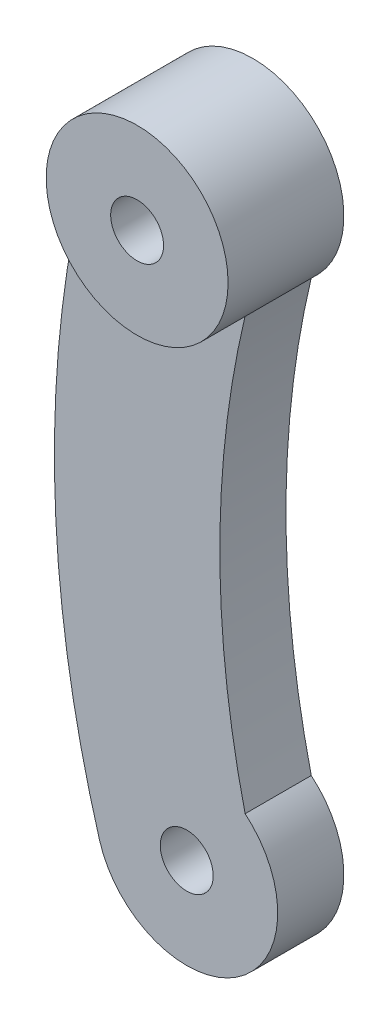
ISO-10303-21;
HEADER;
FILE_DESCRIPTION(('STEP AP214'),'2;1');
FILE_NAME('part.step','',(''),(''),'','','');
FILE_SCHEMA(('AUTOMOTIVE_DESIGN { 1 0 10303 214 1 1 1 1 }'));
ENDSEC;
DATA;
#1=APPLICATION_CONTEXT('core data for automotive mechanical design processes');
#2=APPLICATION_PROTOCOL_DEFINITION('international standard','automotive_design',2000,#1);
#3=PRODUCT_CONTEXT('',#1,'mechanical');
#4=PRODUCT('Part','Part','',(#3));
#5=PRODUCT_RELATED_PRODUCT_CATEGORY('part','',(#4));
#6=PRODUCT_DEFINITION_FORMATION('','',#4);
#7=PRODUCT_DEFINITION_CONTEXT('part definition',#1,'design');
#8=PRODUCT_DEFINITION('design','',#6,#7);
#9=PRODUCT_DEFINITION_SHAPE('','',#8);
#10=(LENGTH_UNIT() NAMED_UNIT(*) SI_UNIT(.MILLI.,.METRE.));
#11=(NAMED_UNIT(*) PLANE_ANGLE_UNIT() SI_UNIT($,.RADIAN.));
#12=(NAMED_UNIT(*) SI_UNIT($,.STERADIAN.) SOLID_ANGLE_UNIT());
#13=UNCERTAINTY_MEASURE_WITH_UNIT(LENGTH_MEASURE(1.E-05),#10,'distance_accuracy_value','');
#14=(GEOMETRIC_REPRESENTATION_CONTEXT(3) GLOBAL_UNCERTAINTY_ASSIGNED_CONTEXT((#13)) GLOBAL_UNIT_ASSIGNED_CONTEXT((#10,
#11,#12)) REPRESENTATION_CONTEXT('',''));
#15=CARTESIAN_POINT('',(0.,0.,0.));
#16=DIRECTION('',(0.,0.,1.));
#17=DIRECTION('',(1.,0.,0.));
#18=AXIS2_PLACEMENT_3D('',#15,#16,#17);
#19=CARTESIAN_POINT('',(0.,34.5,4.));
#20=DIRECTION('',(0.,0.,-1.));
#21=DIRECTION('',(-1.,0.,0.));
#22=AXIS2_PLACEMENT_3D('',#19,#20,#21);
#23=CYLINDRICAL_SURFACE('',#22,1.6);
#24=CARTESIAN_POINT('',(0.,34.5,7.));
#25=DIRECTION('',(0.,0.,1.));
#26=DIRECTION('',(1.,0.,0.));
#27=AXIS2_PLACEMENT_3D('',#24,#25,#26);
#28=CIRCLE('',#27,1.6);
#29=CARTESIAN_POINT('',(1.6,34.5,7.));
#30=VERTEX_POINT('',#29);
#31=EDGE_CURVE('E176',#30,#30,#28,.T.);
#32=ORIENTED_EDGE('',*,*,#31,.T.);
#33=EDGE_LOOP('',(#32));
#34=FACE_BOUND('',#33,.T.);
#35=CARTESIAN_POINT('',(0.,34.5,4.));
#36=DIRECTION('',(0.,0.,-1.));
#37=DIRECTION('',(-1.,0.,0.));
#38=AXIS2_PLACEMENT_3D('',#35,#36,#37);
#39=CIRCLE('',#38,1.6);
#40=CARTESIAN_POINT('',(-1.6,34.5,4.));
#41=VERTEX_POINT('',#40);
#42=EDGE_CURVE('E36',#41,#41,#39,.T.);
#43=ORIENTED_EDGE('',*,*,#42,.T.);
#44=EDGE_LOOP('',(#43));
#45=FACE_BOUND('',#44,.T.);
#46=ADVANCED_FACE('F32',(#34,#45),#23,.F.);
#47=CARTESIAN_POINT('',(29.1312499999998,8.625,4.));
#48=DIRECTION('',(0.,0.,1.));
#49=DIRECTION('',(1.,0.,0.));
#50=AXIS2_PLACEMENT_3D('',#47,#48,#49);
#51=PLANE('',#50);
#52=CARTESIAN_POINT('',(0.,34.5,4.));
#53=DIRECTION('',(0.,0.,1.));
#54=DIRECTION('',(1.,0.,0.));
#55=AXIS2_PLACEMENT_3D('',#52,#53,#54);
#56=CIRCLE('',#55,5.49999999999999);
#57=CARTESIAN_POINT('',(-5.27370911335115,36.061407117877,4.));
#58=VERTEX_POINT('',#57);
#59=CARTESIAN_POINT('',(3.53020723096406,30.2824607996547,4.));
#60=VERTEX_POINT('',#59);
#61=EDGE_CURVE('E179',#58,#60,#56,.T.);
#62=ORIENTED_EDGE('',*,*,#61,.F.);
#63=CARTESIAN_POINT('',(58.2624999999997,17.25,4.));
#64=DIRECTION('',(0.,0.,1.));
#65=DIRECTION('',(1.,0.,0.));
#66=AXIS2_PLACEMENT_3D('',#63,#64,#65);
#67=CIRCLE('',#66,66.2624999999997);
#68=CARTESIAN_POINT('',(-5.27370911335115,-1.56140711787698,4.));
#69=VERTEX_POINT('',#68);
#70=EDGE_CURVE('E192',#58,#69,#67,.T.);
#71=ORIENTED_EDGE('',*,*,#70,.T.);
#72=CARTESIAN_POINT('',(0.,0.,4.));
#73=DIRECTION('',(0.,0.,1.));
#74=DIRECTION('',(1.,0.,0.));
#75=AXIS2_PLACEMENT_3D('',#72,#73,#74);
#76=CIRCLE('',#75,5.49999999999999);
#77=CARTESIAN_POINT('',(3.53020723096407,4.21753920034527,4.));
#78=VERTEX_POINT('',#77);
#79=EDGE_CURVE('E84',#69,#78,#76,.T.);
#80=ORIENTED_EDGE('',*,*,#79,.T.);
#81=CARTESIAN_POINT('',(58.2624999999997,17.25,4.));
#82=DIRECTION('',(0.,0.,-1.));
#83=DIRECTION('',(1.,0.,0.));
#84=AXIS2_PLACEMENT_3D('',#81,#82,#83);
#85=CIRCLE('',#84,56.2624999999997);
#86=EDGE_CURVE('E58',#78,#60,#85,.T.);
#87=ORIENTED_EDGE('',*,*,#86,.T.);
#88=EDGE_LOOP('',(#62,#71,#80,#87));
#89=FACE_BOUND('',#88,.T.);
#90=CARTESIAN_POINT('',(0.,0.,4.));
#91=DIRECTION('',(0.,0.,1.));
#92=DIRECTION('',(1.,0.,0.));
#93=AXIS2_PLACEMENT_3D('',#90,#91,#92);
#94=CIRCLE('',#93,1.6);
#95=CARTESIAN_POINT('',(1.6,0.,4.));
#96=VERTEX_POINT('',#95);
#97=EDGE_CURVE('E187',#96,#96,#94,.T.);
#98=ORIENTED_EDGE('',*,*,#97,.F.);
#99=EDGE_LOOP('',(#98));
#100=FACE_BOUND('',#99,.T.);
#101=ADVANCED_FACE('F226',(#89,#100),#51,.T.);
#102=CARTESIAN_POINT('',(29.1312499999998,8.625,0.));
#103=DIRECTION('',(0.,0.,1.));
#104=DIRECTION('',(1.,0.,0.));
#105=AXIS2_PLACEMENT_3D('',#102,#103,#104);
#106=PLANE('',#105);
#107=DIRECTION('',(0.866025403784439,0.5,0.));
#108=VECTOR('',#107,1.);
#109=CARTESIAN_POINT('',(-2.9,36.1743157806499,0.));
#110=LINE('',#109,#108);
#111=CARTESIAN_POINT('',(-2.89999999999999,36.1743157806499,0.));
#112=VERTEX_POINT('',#111);
#113=CARTESIAN_POINT('',(0.,37.8486315612998,0.));
#114=VERTEX_POINT('',#113);
#115=EDGE_CURVE('E157',#112,#114,#110,.T.);
#116=ORIENTED_EDGE('',*,*,#115,.F.);
#117=DIRECTION('',(0.,1.,0.));
#118=VECTOR('',#117,1.);
#119=CARTESIAN_POINT('',(-2.9,32.8256842193501,0.));
#120=LINE('',#119,#118);
#121=CARTESIAN_POINT('',(-2.9,32.8256842193501,0.));
#122=VERTEX_POINT('',#121);
#123=EDGE_CURVE('E49',#122,#112,#120,.T.);
#124=ORIENTED_EDGE('',*,*,#123,.F.);
#125=DIRECTION('',(-0.866025403784438,0.500000000000001,0.));
#126=VECTOR('',#125,1.);
#127=CARTESIAN_POINT('',(0.,31.1513684387002,0.));
#128=LINE('',#127,#126);
#129=CARTESIAN_POINT('',(0.,31.1513684387002,0.));
#130=VERTEX_POINT('',#129);
#131=EDGE_CURVE('E143',#130,#122,#128,.T.);
#132=ORIENTED_EDGE('',*,*,#131,.F.);
#133=DIRECTION('',(-0.866025403784438,-0.500000000000001,0.));
#134=VECTOR('',#133,1.);
#135=CARTESIAN_POINT('',(2.9,32.8256842193501,0.));
#136=LINE('',#135,#134);
#137=CARTESIAN_POINT('',(2.9,32.8256842193501,0.));
#138=VERTEX_POINT('',#137);
#139=EDGE_CURVE('E146',#138,#130,#136,.T.);
#140=ORIENTED_EDGE('',*,*,#139,.F.);
#141=DIRECTION('',(0.,-1.,0.));
#142=VECTOR('',#141,1.);
#143=CARTESIAN_POINT('',(2.9,36.1743157806499,0.));
#144=LINE('',#143,#142);
#145=CARTESIAN_POINT('',(2.9,36.1743157806499,0.));
#146=VERTEX_POINT('',#145);
#147=EDGE_CURVE('E162',#146,#138,#144,.T.);
#148=ORIENTED_EDGE('',*,*,#147,.F.);
#149=DIRECTION('',(0.866025403784439,-0.499999999999999,0.));
#150=VECTOR('',#149,1.);
#151=CARTESIAN_POINT('',(0.,37.8486315612998,0.));
#152=LINE('',#151,#150);
#153=EDGE_CURVE('E159',#114,#146,#152,.T.);
#154=ORIENTED_EDGE('',*,*,#153,.F.);
#155=EDGE_LOOP('',(#116,#124,#132,#140,#148,#154));
#156=FACE_BOUND('',#155,.T.);
#157=CARTESIAN_POINT('',(58.2624999999997,17.25,0.));
#158=DIRECTION('',(0.,0.,1.));
#159=DIRECTION('',(1.,0.,0.));
#160=AXIS2_PLACEMENT_3D('',#157,#158,#159);
#161=CIRCLE('',#160,66.2624999999997);
#162=CARTESIAN_POINT('',(-5.27370911335115,36.061407117877,0.));
#163=VERTEX_POINT('',#162);
#164=CARTESIAN_POINT('',(-5.27370911335115,-1.56140711787698,0.));
#165=VERTEX_POINT('',#164);
#166=EDGE_CURVE('E214',#163,#165,#161,.T.);
#167=ORIENTED_EDGE('',*,*,#166,.F.);
#168=CARTESIAN_POINT('',(0.,34.5,0.));
#169=DIRECTION('',(0.,0.,1.));
#170=DIRECTION('',(1.,0.,0.));
#171=AXIS2_PLACEMENT_3D('',#168,#169,#170);
#172=CIRCLE('',#171,5.49999999999999);
#173=CARTESIAN_POINT('',(3.53020723096406,30.2824607996547,0.));
#174=VERTEX_POINT('',#173);
#175=EDGE_CURVE('E79',#174,#163,#172,.T.);
#176=ORIENTED_EDGE('',*,*,#175,.F.);
#177=CARTESIAN_POINT('',(58.2624999999997,17.25,0.));
#178=DIRECTION('',(0.,0.,-1.));
#179=DIRECTION('',(1.,0.,0.));
#180=AXIS2_PLACEMENT_3D('',#177,#178,#179);
#181=CIRCLE('',#180,56.2624999999997);
#182=CARTESIAN_POINT('',(3.53020723096407,4.21753920034527,0.));
#183=VERTEX_POINT('',#182);
#184=EDGE_CURVE('E210',#183,#174,#181,.T.);
#185=ORIENTED_EDGE('',*,*,#184,.F.);
#186=CARTESIAN_POINT('',(0.,0.,0.));
#187=DIRECTION('',(0.,0.,1.));
#188=DIRECTION('',(1.,0.,0.));
#189=AXIS2_PLACEMENT_3D('',#186,#187,#188);
#190=CIRCLE('',#189,5.49999999999999);
#191=EDGE_CURVE('E212',#165,#183,#190,.T.);
#192=ORIENTED_EDGE('',*,*,#191,.F.);
#193=EDGE_LOOP('',(#167,#176,#185,#192));
#194=FACE_BOUND('',#193,.T.);
#195=CARTESIAN_POINT('',(0.,0.,0.));
#196=DIRECTION('',(0.,0.,1.));
#197=DIRECTION('',(1.,0.,0.));
#198=AXIS2_PLACEMENT_3D('',#195,#196,#197);
#199=CIRCLE('',#198,1.6);
#200=CARTESIAN_POINT('',(1.6,0.,0.));
#201=VERTEX_POINT('',#200);
#202=EDGE_CURVE('E183',#201,#201,#199,.T.);
#203=ORIENTED_EDGE('',*,*,#202,.T.);
#204=EDGE_LOOP('',(#203));
#205=FACE_BOUND('',#204,.T.);
#206=ADVANCED_FACE('F228',(#156,#194,#205),#106,.F.);
#207=CARTESIAN_POINT('',(58.2624999999997,17.25,4.));
#208=DIRECTION('',(0.,0.,-1.));
#209=DIRECTION('',(-1.,0.,0.));
#210=AXIS2_PLACEMENT_3D('',#207,#208,#209);
#211=CYLINDRICAL_SURFACE('',#210,66.2624999999997);
#212=ORIENTED_EDGE('',*,*,#166,.T.);
#213=DIRECTION('',(0.,0.,-1.));
#214=VECTOR('',#213,1.);
#215=CARTESIAN_POINT('',(-5.27370911335115,-1.56140711787698,4.));
#216=LINE('',#215,#214);
#217=EDGE_CURVE('E11',#69,#165,#216,.T.);
#218=ORIENTED_EDGE('',*,*,#217,.F.);
#219=ORIENTED_EDGE('',*,*,#70,.F.);
#220=DIRECTION('',(0.,0.,-1.));
#221=VECTOR('',#220,1.);
#222=CARTESIAN_POINT('',(-5.27370911335115,36.061407117877,4.));
#223=LINE('',#222,#221);
#224=EDGE_CURVE('E196',#58,#163,#223,.T.);
#225=ORIENTED_EDGE('',*,*,#224,.T.);
#226=EDGE_LOOP('',(#212,#218,#219,#225));
#227=FACE_BOUND('',#226,.T.);
#228=ADVANCED_FACE('F34',(#227),#211,.T.);
#229=CARTESIAN_POINT('',(0.,0.,4.));
#230=DIRECTION('',(0.,0.,-1.));
#231=DIRECTION('',(-1.,0.,0.));
#232=AXIS2_PLACEMENT_3D('',#229,#230,#231);
#233=CYLINDRICAL_SURFACE('',#232,5.49999999999999);
#234=ORIENTED_EDGE('',*,*,#191,.T.);
#235=DIRECTION('',(0.,0.,-1.));
#236=VECTOR('',#235,1.);
#237=CARTESIAN_POINT('',(3.53020723096407,4.21753920034527,4.));
#238=LINE('',#237,#236);
#239=EDGE_CURVE('E41',#78,#183,#238,.T.);
#240=ORIENTED_EDGE('',*,*,#239,.F.);
#241=ORIENTED_EDGE('',*,*,#79,.F.);
#242=ORIENTED_EDGE('',*,*,#217,.T.);
#243=EDGE_LOOP('',(#234,#240,#241,#242));
#244=FACE_BOUND('',#243,.T.);
#245=ADVANCED_FACE('F245',(#244),#233,.T.);
#246=CARTESIAN_POINT('',(58.2624999999997,17.25,4.));
#247=DIRECTION('',(0.,0.,-1.));
#248=DIRECTION('',(-1.,0.,0.));
#249=AXIS2_PLACEMENT_3D('',#246,#247,#248);
#250=CYLINDRICAL_SURFACE('',#249,56.2624999999997);
#251=ORIENTED_EDGE('',*,*,#184,.T.);
#252=DIRECTION('',(0.,0.,-1.));
#253=VECTOR('',#252,1.);
#254=CARTESIAN_POINT('',(3.53020723096406,30.2824607996547,4.));
#255=LINE('',#254,#253);
#256=EDGE_CURVE('E198',#60,#174,#255,.T.);
#257=ORIENTED_EDGE('',*,*,#256,.F.);
#258=ORIENTED_EDGE('',*,*,#86,.F.);
#259=ORIENTED_EDGE('',*,*,#239,.T.);
#260=EDGE_LOOP('',(#251,#257,#258,#259));
#261=FACE_BOUND('',#260,.T.);
#262=ADVANCED_FACE('F243',(#261),#250,.F.);
#263=CARTESIAN_POINT('',(0.,34.5,4.));
#264=DIRECTION('',(0.,0.,-1.));
#265=DIRECTION('',(-1.,0.,0.));
#266=AXIS2_PLACEMENT_3D('',#263,#264,#265);
#267=CYLINDRICAL_SURFACE('',#266,5.49999999999999);
#268=ORIENTED_EDGE('',*,*,#175,.T.);
#269=ORIENTED_EDGE('',*,*,#224,.F.);
#270=ORIENTED_EDGE('',*,*,#61,.T.);
#271=ORIENTED_EDGE('',*,*,#256,.T.);
#272=EDGE_LOOP('',(#268,#269,#270,#271));
#273=FACE_BOUND('',#272,.T.);
#274=CARTESIAN_POINT('',(0.,34.5,7.));
#275=DIRECTION('',(0.,0.,1.));
#276=DIRECTION('',(1.,0.,0.));
#277=AXIS2_PLACEMENT_3D('',#274,#275,#276);
#278=CIRCLE('',#277,5.49999999999999);
#279=CARTESIAN_POINT('',(5.49999999999999,34.5,7.));
#280=VERTEX_POINT('',#279);
#281=EDGE_CURVE('E180',#280,#280,#278,.T.);
#282=ORIENTED_EDGE('',*,*,#281,.F.);
#283=EDGE_LOOP('',(#282));
#284=FACE_BOUND('',#283,.T.);
#285=ADVANCED_FACE('F240',(#273,#284),#267,.T.);
#286=CARTESIAN_POINT('',(0.,0.,4.));
#287=DIRECTION('',(0.,0.,-1.));
#288=DIRECTION('',(-1.,0.,0.));
#289=AXIS2_PLACEMENT_3D('',#286,#287,#288);
#290=CYLINDRICAL_SURFACE('',#289,1.6);
#291=ORIENTED_EDGE('',*,*,#97,.T.);
#292=EDGE_LOOP('',(#291));
#293=FACE_BOUND('',#292,.T.);
#294=ORIENTED_EDGE('',*,*,#202,.F.);
#295=EDGE_LOOP('',(#294));
#296=FACE_BOUND('',#295,.T.);
#297=ADVANCED_FACE('F223',(#293,#296),#290,.F.);
#298=CARTESIAN_POINT('',(0.,34.5,7.));
#299=DIRECTION('',(0.,0.,1.));
#300=DIRECTION('',(1.,0.,0.));
#301=AXIS2_PLACEMENT_3D('',#298,#299,#300);
#302=PLANE('',#301);
#303=ORIENTED_EDGE('',*,*,#281,.T.);
#304=EDGE_LOOP('',(#303));
#305=FACE_BOUND('',#304,.T.);
#306=ORIENTED_EDGE('',*,*,#31,.F.);
#307=EDGE_LOOP('',(#306));
#308=FACE_BOUND('',#307,.T.);
#309=ADVANCED_FACE('F257',(#305,#308),#302,.T.);
#310=CARTESIAN_POINT('',(-2.9,32.8256842193501,4.));
#311=DIRECTION('',(-1.,0.,0.));
#312=DIRECTION('',(0.,-1.,0.));
#313=AXIS2_PLACEMENT_3D('',#310,#311,#312);
#314=PLANE('',#313);
#315=ORIENTED_EDGE('',*,*,#123,.T.);
#316=DIRECTION('',(0.,0.,-1.));
#317=VECTOR('',#316,1.);
#318=CARTESIAN_POINT('',(-2.9,36.1743157806499,4.));
#319=LINE('',#318,#317);
#320=CARTESIAN_POINT('',(-2.9,36.1743157806499,4.));
#321=VERTEX_POINT('',#320);
#322=EDGE_CURVE('E120',#321,#112,#319,.T.);
#323=ORIENTED_EDGE('',*,*,#322,.F.);
#324=DIRECTION('',(0.,1.,0.));
#325=VECTOR('',#324,1.);
#326=CARTESIAN_POINT('',(-2.9,32.8256842193501,4.));
#327=LINE('',#326,#325);
#328=CARTESIAN_POINT('',(-2.9,32.8256842193501,4.));
#329=VERTEX_POINT('',#328);
#330=EDGE_CURVE('E124',#329,#321,#327,.T.);
#331=ORIENTED_EDGE('',*,*,#330,.F.);
#332=DIRECTION('',(0.,0.,-1.));
#333=VECTOR('',#332,1.);
#334=CARTESIAN_POINT('',(-2.9,32.8256842193501,4.));
#335=LINE('',#334,#333);
#336=EDGE_CURVE('E167',#329,#122,#335,.T.);
#337=ORIENTED_EDGE('',*,*,#336,.T.);
#338=EDGE_LOOP('',(#315,#323,#331,#337));
#339=FACE_BOUND('',#338,.T.);
#340=ADVANCED_FACE('F122',(#339),#314,.F.);
#341=CARTESIAN_POINT('',(0.,31.1513684387002,4.));
#342=DIRECTION('',(-0.500000000000001,-0.866025403784438,0.));
#343=DIRECTION('',(0.866025403784438,-0.500000000000001,0.));
#344=AXIS2_PLACEMENT_3D('',#341,#342,#343);
#345=PLANE('',#344);
#346=ORIENTED_EDGE('',*,*,#131,.T.);
#347=ORIENTED_EDGE('',*,*,#336,.F.);
#348=DIRECTION('',(-0.866025403784438,0.500000000000001,0.));
#349=VECTOR('',#348,1.);
#350=CARTESIAN_POINT('',(0.,31.1513684387002,4.));
#351=LINE('',#350,#349);
#352=CARTESIAN_POINT('',(0.,31.1513684387002,4.));
#353=VERTEX_POINT('',#352);
#354=EDGE_CURVE('E130',#353,#329,#351,.T.);
#355=ORIENTED_EDGE('',*,*,#354,.F.);
#356=DIRECTION('',(0.,0.,-1.));
#357=VECTOR('',#356,1.);
#358=CARTESIAN_POINT('',(0.,31.1513684387002,4.));
#359=LINE('',#358,#357);
#360=EDGE_CURVE('E169',#353,#130,#359,.T.);
#361=ORIENTED_EDGE('',*,*,#360,.T.);
#362=EDGE_LOOP('',(#346,#347,#355,#361));
#363=FACE_BOUND('',#362,.T.);
#364=ADVANCED_FACE('F274',(#363),#345,.F.);
#365=CARTESIAN_POINT('',(2.9,32.8256842193501,4.));
#366=DIRECTION('',(0.500000000000001,-0.866025403784438,0.));
#367=DIRECTION('',(0.866025403784438,0.500000000000001,0.));
#368=AXIS2_PLACEMENT_3D('',#365,#366,#367);
#369=PLANE('',#368);
#370=ORIENTED_EDGE('',*,*,#139,.T.);
#371=ORIENTED_EDGE('',*,*,#360,.F.);
#372=DIRECTION('',(-0.866025403784438,-0.500000000000001,0.));
#373=VECTOR('',#372,1.);
#374=CARTESIAN_POINT('',(2.9,32.8256842193501,4.));
#375=LINE('',#374,#373);
#376=CARTESIAN_POINT('',(2.9,32.8256842193501,4.));
#377=VERTEX_POINT('',#376);
#378=EDGE_CURVE('E153',#377,#353,#375,.T.);
#379=ORIENTED_EDGE('',*,*,#378,.F.);
#380=DIRECTION('',(0.,0.,-1.));
#381=VECTOR('',#380,1.);
#382=CARTESIAN_POINT('',(2.9,32.8256842193501,4.));
#383=LINE('',#382,#381);
#384=EDGE_CURVE('E171',#377,#138,#383,.T.);
#385=ORIENTED_EDGE('',*,*,#384,.T.);
#386=EDGE_LOOP('',(#370,#371,#379,#385));
#387=FACE_BOUND('',#386,.T.);
#388=ADVANCED_FACE('F277',(#387),#369,.F.);
#389=CARTESIAN_POINT('',(2.9,36.1743157806499,4.));
#390=DIRECTION('',(1.,0.,0.));
#391=DIRECTION('',(0.,0.,-1.));
#392=AXIS2_PLACEMENT_3D('',#389,#390,#391);
#393=PLANE('',#392);
#394=ORIENTED_EDGE('',*,*,#147,.T.);
#395=ORIENTED_EDGE('',*,*,#384,.F.);
#396=DIRECTION('',(0.,-1.,0.));
#397=VECTOR('',#396,1.);
#398=CARTESIAN_POINT('',(2.9,36.1743157806499,4.));
#399=LINE('',#398,#397);
#400=CARTESIAN_POINT('',(2.9,36.1743157806499,4.));
#401=VERTEX_POINT('',#400);
#402=EDGE_CURVE('E150',#401,#377,#399,.T.);
#403=ORIENTED_EDGE('',*,*,#402,.F.);
#404=DIRECTION('',(0.,0.,-1.));
#405=VECTOR('',#404,1.);
#406=CARTESIAN_POINT('',(2.9,36.1743157806499,4.));
#407=LINE('',#406,#405);
#408=EDGE_CURVE('E173',#401,#146,#407,.T.);
#409=ORIENTED_EDGE('',*,*,#408,.T.);
#410=EDGE_LOOP('',(#394,#395,#403,#409));
#411=FACE_BOUND('',#410,.T.);
#412=ADVANCED_FACE('F281',(#411),#393,.F.);
#413=CARTESIAN_POINT('',(0.,37.8486315612998,4.));
#414=DIRECTION('',(0.499999999999999,0.866025403784439,0.));
#415=DIRECTION('',(-0.866025403784439,0.499999999999999,0.));
#416=AXIS2_PLACEMENT_3D('',#413,#414,#415);
#417=PLANE('',#416);
#418=ORIENTED_EDGE('',*,*,#153,.T.);
#419=ORIENTED_EDGE('',*,*,#408,.F.);
#420=DIRECTION('',(0.866025403784439,-0.499999999999999,0.));
#421=VECTOR('',#420,1.);
#422=CARTESIAN_POINT('',(0.,37.8486315612998,4.));
#423=LINE('',#422,#421);
#424=CARTESIAN_POINT('',(0.,37.8486315612998,4.));
#425=VERTEX_POINT('',#424);
#426=EDGE_CURVE('E138',#425,#401,#423,.T.);
#427=ORIENTED_EDGE('',*,*,#426,.F.);
#428=DIRECTION('',(0.,0.,-1.));
#429=VECTOR('',#428,1.);
#430=CARTESIAN_POINT('',(0.,37.8486315612998,4.));
#431=LINE('',#430,#429);
#432=EDGE_CURVE('E129',#425,#114,#431,.T.);
#433=ORIENTED_EDGE('',*,*,#432,.T.);
#434=EDGE_LOOP('',(#418,#419,#427,#433));
#435=FACE_BOUND('',#434,.T.);
#436=ADVANCED_FACE('F271',(#435),#417,.F.);
#437=CARTESIAN_POINT('',(-2.9,36.1743157806499,4.));
#438=DIRECTION('',(-0.5,0.866025403784439,0.));
#439=DIRECTION('',(-0.866025403784439,-0.5,0.));
#440=AXIS2_PLACEMENT_3D('',#437,#438,#439);
#441=PLANE('',#440);
#442=ORIENTED_EDGE('',*,*,#115,.T.);
#443=ORIENTED_EDGE('',*,*,#432,.F.);
#444=DIRECTION('',(0.866025403784439,0.5,0.));
#445=VECTOR('',#444,1.);
#446=CARTESIAN_POINT('',(-2.9,36.1743157806499,4.));
#447=LINE('',#446,#445);
#448=EDGE_CURVE('E133',#321,#425,#447,.T.);
#449=ORIENTED_EDGE('',*,*,#448,.F.);
#450=ORIENTED_EDGE('',*,*,#322,.T.);
#451=EDGE_LOOP('',(#442,#443,#449,#450));
#452=FACE_BOUND('',#451,.T.);
#453=ADVANCED_FACE('F134',(#452),#441,.F.);
#454=CARTESIAN_POINT('',(0.,0.,4.));
#455=DIRECTION('',(0.,0.,-1.));
#456=DIRECTION('',(-1.,0.,0.));
#457=AXIS2_PLACEMENT_3D('',#454,#455,#456);
#458=PLANE('',#457);
#459=ORIENTED_EDGE('',*,*,#42,.F.);
#460=EDGE_LOOP('',(#459));
#461=FACE_BOUND('',#460,.T.);
#462=ORIENTED_EDGE('',*,*,#330,.T.);
#463=ORIENTED_EDGE('',*,*,#448,.T.);
#464=ORIENTED_EDGE('',*,*,#426,.T.);
#465=ORIENTED_EDGE('',*,*,#402,.T.);
#466=ORIENTED_EDGE('',*,*,#378,.T.);
#467=ORIENTED_EDGE('',*,*,#354,.T.);
#468=EDGE_LOOP('',(#462,#463,#464,#465,#466,#467));
#469=FACE_BOUND('',#468,.T.);
#470=ADVANCED_FACE('F140',(#461,#469),#458,.T.);
#471=CLOSED_SHELL('',(#46,#101,#206,#228,#245,#262,#285,#297,#309,#340,#364,#388,#412,#436,#453,#470));
#472=MANIFOLD_SOLID_BREP('B2',#471);
#473=ADVANCED_BREP_SHAPE_REPRESENTATION('',(#18,#472),#14);
#474=SHAPE_DEFINITION_REPRESENTATION(#9,#473);
ENDSEC;
END-ISO-10303-21;
